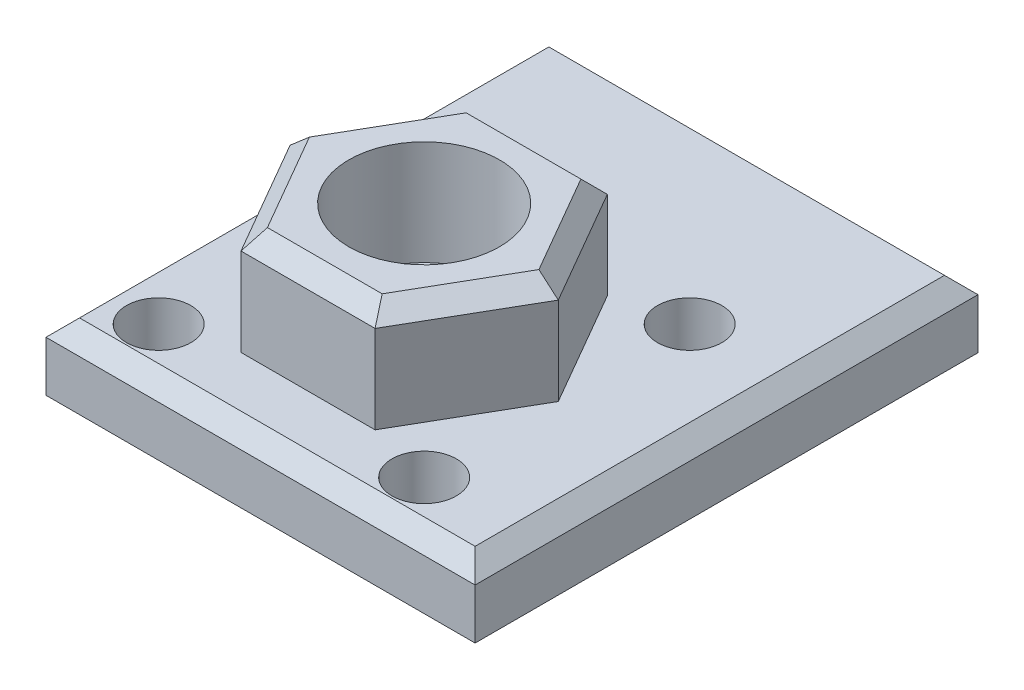
ISO-10303-21;
HEADER;
FILE_DESCRIPTION(('STEP AP214'),'2;1');
FILE_NAME('part.step','',(''),(''),'','','');
FILE_SCHEMA(('AUTOMOTIVE_DESIGN { 1 0 10303 214 1 1 1 1 }'));
ENDSEC;
DATA;
#1=APPLICATION_CONTEXT('core data for automotive mechanical design processes');
#2=APPLICATION_PROTOCOL_DEFINITION('international standard','automotive_design',2000,#1);
#3=PRODUCT_CONTEXT('',#1,'mechanical');
#4=PRODUCT('Part','Part','',(#3));
#5=PRODUCT_RELATED_PRODUCT_CATEGORY('part','',(#4));
#6=PRODUCT_DEFINITION_FORMATION('','',#4);
#7=PRODUCT_DEFINITION_CONTEXT('part definition',#1,'design');
#8=PRODUCT_DEFINITION('design','',#6,#7);
#9=PRODUCT_DEFINITION_SHAPE('','',#8);
#10=(LENGTH_UNIT() NAMED_UNIT(*) SI_UNIT(.MILLI.,.METRE.));
#11=(NAMED_UNIT(*) PLANE_ANGLE_UNIT() SI_UNIT($,.RADIAN.));
#12=(NAMED_UNIT(*) SI_UNIT($,.STERADIAN.) SOLID_ANGLE_UNIT());
#13=UNCERTAINTY_MEASURE_WITH_UNIT(LENGTH_MEASURE(1.E-05),#10,'distance_accuracy_value','');
#14=(GEOMETRIC_REPRESENTATION_CONTEXT(3) GLOBAL_UNCERTAINTY_ASSIGNED_CONTEXT((#13)) GLOBAL_UNIT_ASSIGNED_CONTEXT((#10,
#11,#12)) REPRESENTATION_CONTEXT('',''));
#15=CARTESIAN_POINT('',(0.,0.,0.));
#16=DIRECTION('',(0.,0.,1.));
#17=DIRECTION('',(1.,0.,0.));
#18=AXIS2_PLACEMENT_3D('',#15,#16,#17);
#19=CARTESIAN_POINT('',(18.415,0.,-30.734));
#20=DIRECTION('',(0.,1.,0.));
#21=DIRECTION('',(0.,0.,1.));
#22=AXIS2_PLACEMENT_3D('',#19,#20,#21);
#23=CYLINDRICAL_SURFACE('',#22,4.826);
#24=CARTESIAN_POINT('',(18.415,0.,-30.734));
#25=DIRECTION('',(0.,1.,0.));
#26=DIRECTION('',(0.,0.,1.));
#27=AXIS2_PLACEMENT_3D('',#24,#25,#26);
#28=CIRCLE('',#27,4.826);
#29=CARTESIAN_POINT('',(18.415,0.,-25.908));
#30=VERTEX_POINT('',#29);
#31=EDGE_CURVE('E164',#30,#30,#28,.T.);
#32=ORIENTED_EDGE('',*,*,#31,.F.);
#33=EDGE_LOOP('',(#32));
#34=FACE_BOUND('',#33,.T.);
#35=CARTESIAN_POINT('',(18.415,6.35,-30.734));
#36=DIRECTION('',(0.,1.,0.));
#37=DIRECTION('',(0.,0.,1.));
#38=AXIS2_PLACEMENT_3D('',#35,#36,#37);
#39=CIRCLE('',#38,4.826);
#40=CARTESIAN_POINT('',(18.415,6.35,-25.908));
#41=VERTEX_POINT('',#40);
#42=EDGE_CURVE('E234',#41,#41,#39,.F.);
#43=ORIENTED_EDGE('',*,*,#42,.F.);
#44=EDGE_LOOP('',(#43));
#45=FACE_BOUND('',#44,.T.);
#46=ADVANCED_FACE('F36',(#34,#45),#23,.F.);
#47=CARTESIAN_POINT('',(0.,6.35,0.));
#48=DIRECTION('',(0.,1.,0.));
#49=DIRECTION('',(0.,0.,1.));
#50=AXIS2_PLACEMENT_3D('',#47,#48,#49);
#51=PLANE('',#50);
#52=DIRECTION('',(-1.,0.,0.));
#53=VECTOR('',#52,1.);
#54=CARTESIAN_POINT('',(0.,6.35,-59.3725));
#55=LINE('',#54,#53);
#56=CARTESIAN_POINT('',(39.0525,6.35,-59.3725));
#57=VERTEX_POINT('',#56);
#58=CARTESIAN_POINT('',(1.58749999999999,6.35,-59.3725));
#59=VERTEX_POINT('',#58);
#60=EDGE_CURVE('E241',#57,#59,#55,.T.);
#61=ORIENTED_EDGE('',*,*,#60,.T.);
#62=DIRECTION('',(0.,0.,1.));
#63=VECTOR('',#62,1.);
#64=CARTESIAN_POINT('',(1.58749999999999,6.35,-13.335));
#65=LINE('',#64,#63);
#66=CARTESIAN_POINT('',(1.58749999999999,6.35,-14.9225));
#67=VERTEX_POINT('',#66);
#68=EDGE_CURVE('E243',#59,#67,#65,.T.);
#69=ORIENTED_EDGE('',*,*,#68,.T.);
#70=DIRECTION('',(1.,0.,0.));
#71=VECTOR('',#70,1.);
#72=CARTESIAN_POINT('',(40.64,6.35,-14.9225));
#73=LINE('',#72,#71);
#74=CARTESIAN_POINT('',(39.0525,6.35,-14.9225));
#75=VERTEX_POINT('',#74);
#76=EDGE_CURVE('E233',#67,#75,#73,.T.);
#77=ORIENTED_EDGE('',*,*,#76,.T.);
#78=DIRECTION('',(0.,0.,-1.));
#79=VECTOR('',#78,1.);
#80=CARTESIAN_POINT('',(39.0525,6.35,-60.96));
#81=LINE('',#80,#79);
#82=EDGE_CURVE('E239',#75,#57,#81,.T.);
#83=ORIENTED_EDGE('',*,*,#82,.T.);
#84=EDGE_LOOP('',(#61,#69,#77,#83));
#85=FACE_BOUND('',#84,.T.);
#86=CARTESIAN_POINT('',(5.84264143050334,6.35,-18.161641430503));
#87=DIRECTION('',(0.,1.,0.));
#88=DIRECTION('',(0.,0.,1.));
#89=AXIS2_PLACEMENT_3D('',#86,#87,#88);
#90=CIRCLE('',#89,3.048);
#91=CARTESIAN_POINT('',(5.84264143050334,6.35,-15.113641430503));
#92=VERTEX_POINT('',#91);
#93=EDGE_CURVE('E196',#92,#92,#90,.T.);
#94=ORIENTED_EDGE('',*,*,#93,.F.);
#95=EDGE_LOOP('',(#94));
#96=FACE_BOUND('',#95,.T.);
#97=CARTESIAN_POINT('',(30.9873585694968,6.35,-18.1616414305032));
#98=DIRECTION('',(0.,1.,0.));
#99=DIRECTION('',(0.,0.,1.));
#100=AXIS2_PLACEMENT_3D('',#97,#98,#99);
#101=CIRCLE('',#100,3.048);
#102=CARTESIAN_POINT('',(30.9873585694968,6.35,-15.1136414305032));
#103=VERTEX_POINT('',#102);
#104=EDGE_CURVE('E208',#103,#103,#101,.T.);
#105=ORIENTED_EDGE('',*,*,#104,.F.);
#106=EDGE_LOOP('',(#105));
#107=FACE_BOUND('',#106,.T.);
#108=CARTESIAN_POINT('',(30.9873585694967,6.35,-43.3063585694969));
#109=DIRECTION('',(0.,1.,0.));
#110=DIRECTION('',(0.,0.,1.));
#111=AXIS2_PLACEMENT_3D('',#108,#109,#110);
#112=CIRCLE('',#111,3.048);
#113=CARTESIAN_POINT('',(30.9873585694967,6.35,-40.2583585694969));
#114=VERTEX_POINT('',#113);
#115=EDGE_CURVE('E202',#114,#114,#112,.T.);
#116=ORIENTED_EDGE('',*,*,#115,.F.);
#117=EDGE_LOOP('',(#116));
#118=FACE_BOUND('',#117,.T.);
#119=CARTESIAN_POINT('',(5.84264143050316,6.35,-43.3063585694968));
#120=DIRECTION('',(0.,1.,0.));
#121=DIRECTION('',(0.,0.,1.));
#122=AXIS2_PLACEMENT_3D('',#119,#120,#121);
#123=CIRCLE('',#122,3.048);
#124=CARTESIAN_POINT('',(5.84264143050316,6.35,-40.2583585694968));
#125=VERTEX_POINT('',#124);
#126=EDGE_CURVE('E190',#125,#125,#123,.T.);
#127=ORIENTED_EDGE('',*,*,#126,.F.);
#128=EDGE_LOOP('',(#127));
#129=FACE_BOUND('',#128,.T.);
#130=DIRECTION('',(-0.500000000000001,0.,-0.866025403784438));
#131=VECTOR('',#130,1.);
#132=CARTESIAN_POINT('',(31.115,6.35,-30.734));
#133=LINE('',#132,#131);
#134=CARTESIAN_POINT('',(31.115,6.35,-30.734));
#135=VERTEX_POINT('',#134);
#136=CARTESIAN_POINT('',(24.765,6.35,-41.7325226280624));
#137=VERTEX_POINT('',#136);
#138=EDGE_CURVE('E147',#135,#137,#133,.T.);
#139=ORIENTED_EDGE('',*,*,#138,.F.);
#140=DIRECTION('',(0.499999999999995,0.,-0.866025403784441));
#141=VECTOR('',#140,1.);
#142=CARTESIAN_POINT('',(24.7650000000001,6.35,-19.7354773719377));
#143=LINE('',#142,#141);
#144=CARTESIAN_POINT('',(24.7650000000001,6.35,-19.7354773719377));
#145=VERTEX_POINT('',#144);
#146=EDGE_CURVE('E157',#145,#135,#143,.T.);
#147=ORIENTED_EDGE('',*,*,#146,.F.);
#148=DIRECTION('',(1.,0.,0.));
#149=VECTOR('',#148,1.);
#150=CARTESIAN_POINT('',(12.0650000000001,6.35,-19.7354773719376));
#151=LINE('',#150,#149);
#152=CARTESIAN_POINT('',(12.0650000000001,6.35,-19.7354773719376));
#153=VERTEX_POINT('',#152);
#154=EDGE_CURVE('E180',#153,#145,#151,.T.);
#155=ORIENTED_EDGE('',*,*,#154,.F.);
#156=DIRECTION('',(0.500000000000007,0.,0.866025403784435));
#157=VECTOR('',#156,1.);
#158=CARTESIAN_POINT('',(5.715,6.35,-30.7339999999999));
#159=LINE('',#158,#157);
#160=CARTESIAN_POINT('',(5.715,6.35,-30.7339999999999));
#161=VERTEX_POINT('',#160);
#162=EDGE_CURVE('E177',#161,#153,#159,.T.);
#163=ORIENTED_EDGE('',*,*,#162,.F.);
#164=DIRECTION('',(-0.499999999999995,0.,0.866025403784442));
#165=VECTOR('',#164,1.);
#166=CARTESIAN_POINT('',(12.065,6.35,-41.7325226280623));
#167=LINE('',#166,#165);
#168=CARTESIAN_POINT('',(12.065,6.35,-41.7325226280623));
#169=VERTEX_POINT('',#168);
#170=EDGE_CURVE('E171',#169,#161,#167,.T.);
#171=ORIENTED_EDGE('',*,*,#170,.F.);
#172=DIRECTION('',(-1.,0.,0.));
#173=VECTOR('',#172,1.);
#174=CARTESIAN_POINT('',(24.765,6.35,-41.7325226280624));
#175=LINE('',#174,#173);
#176=EDGE_CURVE('E169',#137,#169,#175,.T.);
#177=ORIENTED_EDGE('',*,*,#176,.F.);
#178=EDGE_LOOP('',(#139,#147,#155,#163,#171,#177));
#179=FACE_BOUND('',#178,.T.);
#180=ADVANCED_FACE('F166',(#85,#96,#107,#118,#129,#179),#51,.T.);
#181=CARTESIAN_POINT('',(0.,0.,0.));
#182=DIRECTION('',(0.,1.,0.));
#183=DIRECTION('',(0.,0.,1.));
#184=AXIS2_PLACEMENT_3D('',#181,#182,#183);
#185=PLANE('',#184);
#186=ORIENTED_EDGE('',*,*,#31,.T.);
#187=EDGE_LOOP('',(#186));
#188=FACE_BOUND('',#187,.T.);
#189=DIRECTION('',(1.,0.,0.));
#190=VECTOR('',#189,1.);
#191=CARTESIAN_POINT('',(40.64,0.,-13.335));
#192=LINE('',#191,#190);
#193=CARTESIAN_POINT('',(0.,0.,-13.335));
#194=VERTEX_POINT('',#193);
#195=CARTESIAN_POINT('',(40.64,0.,-13.335));
#196=VERTEX_POINT('',#195);
#197=EDGE_CURVE('E211',#194,#196,#192,.T.);
#198=ORIENTED_EDGE('',*,*,#197,.F.);
#199=DIRECTION('',(0.,0.,1.));
#200=VECTOR('',#199,1.);
#201=CARTESIAN_POINT('',(0.,0.,-60.96));
#202=LINE('',#201,#200);
#203=CARTESIAN_POINT('',(0.,0.,-60.96));
#204=VERTEX_POINT('',#203);
#205=EDGE_CURVE('E222',#204,#194,#202,.T.);
#206=ORIENTED_EDGE('',*,*,#205,.F.);
#207=DIRECTION('',(-1.,0.,0.));
#208=VECTOR('',#207,1.);
#209=CARTESIAN_POINT('',(40.64,0.,-60.96));
#210=LINE('',#209,#208);
#211=CARTESIAN_POINT('',(40.64,0.,-60.96));
#212=VERTEX_POINT('',#211);
#213=EDGE_CURVE('E219',#212,#204,#210,.T.);
#214=ORIENTED_EDGE('',*,*,#213,.F.);
#215=DIRECTION('',(0.,0.,-1.));
#216=VECTOR('',#215,1.);
#217=CARTESIAN_POINT('',(40.64,0.,-13.335));
#218=LINE('',#217,#216);
#219=EDGE_CURVE('E216',#196,#212,#218,.T.);
#220=ORIENTED_EDGE('',*,*,#219,.F.);
#221=EDGE_LOOP('',(#198,#206,#214,#220));
#222=FACE_BOUND('',#221,.T.);
#223=CARTESIAN_POINT('',(30.9873585694968,0.,-18.1616414305032));
#224=DIRECTION('',(0.,1.,0.));
#225=DIRECTION('',(0.,0.,1.));
#226=AXIS2_PLACEMENT_3D('',#223,#224,#225);
#227=CIRCLE('',#226,3.048);
#228=CARTESIAN_POINT('',(30.9873585694968,0.,-15.1136414305032));
#229=VERTEX_POINT('',#228);
#230=EDGE_CURVE('E205',#229,#229,#227,.T.);
#231=ORIENTED_EDGE('',*,*,#230,.T.);
#232=EDGE_LOOP('',(#231));
#233=FACE_BOUND('',#232,.T.);
#234=CARTESIAN_POINT('',(30.9873585694967,0.,-43.3063585694969));
#235=DIRECTION('',(0.,1.,0.));
#236=DIRECTION('',(0.,0.,1.));
#237=AXIS2_PLACEMENT_3D('',#234,#235,#236);
#238=CIRCLE('',#237,3.048);
#239=CARTESIAN_POINT('',(30.9873585694967,0.,-40.2583585694969));
#240=VERTEX_POINT('',#239);
#241=EDGE_CURVE('E199',#240,#240,#238,.T.);
#242=ORIENTED_EDGE('',*,*,#241,.T.);
#243=EDGE_LOOP('',(#242));
#244=FACE_BOUND('',#243,.T.);
#245=CARTESIAN_POINT('',(5.84264143050334,0.,-18.161641430503));
#246=DIRECTION('',(0.,1.,0.));
#247=DIRECTION('',(0.,0.,1.));
#248=AXIS2_PLACEMENT_3D('',#245,#246,#247);
#249=CIRCLE('',#248,3.048);
#250=CARTESIAN_POINT('',(5.84264143050334,0.,-15.113641430503));
#251=VERTEX_POINT('',#250);
#252=EDGE_CURVE('E193',#251,#251,#249,.T.);
#253=ORIENTED_EDGE('',*,*,#252,.T.);
#254=EDGE_LOOP('',(#253));
#255=FACE_BOUND('',#254,.T.);
#256=CARTESIAN_POINT('',(5.84264143050316,0.,-43.3063585694968));
#257=DIRECTION('',(0.,1.,0.));
#258=DIRECTION('',(0.,0.,1.));
#259=AXIS2_PLACEMENT_3D('',#256,#257,#258);
#260=CIRCLE('',#259,3.048);
#261=CARTESIAN_POINT('',(5.84264143050316,0.,-40.2583585694968));
#262=VERTEX_POINT('',#261);
#263=EDGE_CURVE('E153',#262,#262,#260,.T.);
#264=ORIENTED_EDGE('',*,*,#263,.T.);
#265=EDGE_LOOP('',(#264));
#266=FACE_BOUND('',#265,.T.);
#267=ADVANCED_FACE('F336',(#188,#222,#233,#244,#255,#266),#185,.F.);
#268=CARTESIAN_POINT('',(40.64,6.35,-13.335));
#269=DIRECTION('',(0.,0.,-1.));
#270=DIRECTION('',(-1.,0.,0.));
#271=AXIS2_PLACEMENT_3D('',#268,#269,#270);
#272=PLANE('',#271);
#273=DIRECTION('',(0.,-1.,0.));
#274=VECTOR('',#273,1.);
#275=CARTESIAN_POINT('',(40.64,6.35,-13.335));
#276=LINE('',#275,#274);
#277=CARTESIAN_POINT('',(40.64,4.7625,-13.335));
#278=VERTEX_POINT('',#277);
#279=EDGE_CURVE('E231',#278,#196,#276,.T.);
#280=ORIENTED_EDGE('',*,*,#279,.F.);
#281=DIRECTION('',(-1.,0.,0.));
#282=VECTOR('',#281,1.);
#283=CARTESIAN_POINT('',(0.,4.7625,-13.335));
#284=LINE('',#283,#282);
#285=CARTESIAN_POINT('',(0.,4.7625,-13.335));
#286=VERTEX_POINT('',#285);
#287=EDGE_CURVE('E253',#278,#286,#284,.T.);
#288=ORIENTED_EDGE('',*,*,#287,.T.);
#289=DIRECTION('',(0.,-1.,0.));
#290=VECTOR('',#289,1.);
#291=CARTESIAN_POINT('',(0.,6.35,-13.335));
#292=LINE('',#291,#290);
#293=EDGE_CURVE('E225',#286,#194,#292,.T.);
#294=ORIENTED_EDGE('',*,*,#293,.T.);
#295=ORIENTED_EDGE('',*,*,#197,.T.);
#296=EDGE_LOOP('',(#280,#288,#294,#295));
#297=FACE_BOUND('',#296,.T.);
#298=ADVANCED_FACE('F573',(#297),#272,.F.);
#299=CARTESIAN_POINT('',(40.64,6.35,-13.335));
#300=DIRECTION('',(-1.,0.,0.));
#301=DIRECTION('',(0.,0.,1.));
#302=AXIS2_PLACEMENT_3D('',#299,#300,#301);
#303=PLANE('',#302);
#304=DIRECTION('',(0.,-1.,0.));
#305=VECTOR('',#304,1.);
#306=CARTESIAN_POINT('',(40.64,6.35,-60.96));
#307=LINE('',#306,#305);
#308=CARTESIAN_POINT('',(40.64,4.7625,-60.96));
#309=VERTEX_POINT('',#308);
#310=EDGE_CURVE('E229',#309,#212,#307,.T.);
#311=ORIENTED_EDGE('',*,*,#310,.F.);
#312=DIRECTION('',(0.,0.,1.));
#313=VECTOR('',#312,1.);
#314=CARTESIAN_POINT('',(40.64,4.7625,-13.335));
#315=LINE('',#314,#313);
#316=EDGE_CURVE('E251',#309,#278,#315,.T.);
#317=ORIENTED_EDGE('',*,*,#316,.T.);
#318=ORIENTED_EDGE('',*,*,#279,.T.);
#319=ORIENTED_EDGE('',*,*,#219,.T.);
#320=EDGE_LOOP('',(#311,#317,#318,#319));
#321=FACE_BOUND('',#320,.T.);
#322=ADVANCED_FACE('F564',(#321),#303,.F.);
#323=CARTESIAN_POINT('',(40.64,6.35,-60.96));
#324=DIRECTION('',(0.,0.,1.));
#325=DIRECTION('',(1.,0.,0.));
#326=AXIS2_PLACEMENT_3D('',#323,#324,#325);
#327=PLANE('',#326);
#328=DIRECTION('',(0.,-1.,0.));
#329=VECTOR('',#328,1.);
#330=CARTESIAN_POINT('',(0.,6.35,-60.96));
#331=LINE('',#330,#329);
#332=CARTESIAN_POINT('',(0.,4.7625,-60.96));
#333=VERTEX_POINT('',#332);
#334=EDGE_CURVE('E227',#333,#204,#331,.T.);
#335=ORIENTED_EDGE('',*,*,#334,.F.);
#336=DIRECTION('',(1.,0.,0.));
#337=VECTOR('',#336,1.);
#338=CARTESIAN_POINT('',(40.64,4.7625,-60.96));
#339=LINE('',#338,#337);
#340=EDGE_CURVE('E249',#333,#309,#339,.T.);
#341=ORIENTED_EDGE('',*,*,#340,.T.);
#342=ORIENTED_EDGE('',*,*,#310,.T.);
#343=ORIENTED_EDGE('',*,*,#213,.T.);
#344=EDGE_LOOP('',(#335,#341,#342,#343));
#345=FACE_BOUND('',#344,.T.);
#346=ADVANCED_FACE('F555',(#345),#327,.F.);
#347=CARTESIAN_POINT('',(0.,6.35,-60.96));
#348=DIRECTION('',(1.,0.,0.));
#349=DIRECTION('',(0.,0.,-1.));
#350=AXIS2_PLACEMENT_3D('',#347,#348,#349);
#351=PLANE('',#350);
#352=ORIENTED_EDGE('',*,*,#293,.F.);
#353=DIRECTION('',(0.,0.,-1.));
#354=VECTOR('',#353,1.);
#355=CARTESIAN_POINT('',(0.,4.7625,-60.96));
#356=LINE('',#355,#354);
#357=EDGE_CURVE('E246',#286,#333,#356,.T.);
#358=ORIENTED_EDGE('',*,*,#357,.T.);
#359=ORIENTED_EDGE('',*,*,#334,.T.);
#360=ORIENTED_EDGE('',*,*,#205,.T.);
#361=EDGE_LOOP('',(#352,#358,#359,#360));
#362=FACE_BOUND('',#361,.T.);
#363=ADVANCED_FACE('F547',(#362),#351,.F.);
#364=CARTESIAN_POINT('',(30.9873585694968,6.35,-18.1616414305032));
#365=DIRECTION('',(0.,-1.,0.));
#366=DIRECTION('',(0.,0.,-1.));
#367=AXIS2_PLACEMENT_3D('',#364,#365,#366);
#368=CYLINDRICAL_SURFACE('',#367,3.048);
#369=ORIENTED_EDGE('',*,*,#104,.T.);
#370=EDGE_LOOP('',(#369));
#371=FACE_BOUND('',#370,.T.);
#372=ORIENTED_EDGE('',*,*,#230,.F.);
#373=EDGE_LOOP('',(#372));
#374=FACE_BOUND('',#373,.T.);
#375=ADVANCED_FACE('F538',(#371,#374),#368,.F.);
#376=CARTESIAN_POINT('',(30.9873585694967,6.35,-43.3063585694969));
#377=DIRECTION('',(0.,-1.,0.));
#378=DIRECTION('',(0.,0.,-1.));
#379=AXIS2_PLACEMENT_3D('',#376,#377,#378);
#380=CYLINDRICAL_SURFACE('',#379,3.048);
#381=ORIENTED_EDGE('',*,*,#115,.T.);
#382=EDGE_LOOP('',(#381));
#383=FACE_BOUND('',#382,.T.);
#384=ORIENTED_EDGE('',*,*,#241,.F.);
#385=EDGE_LOOP('',(#384));
#386=FACE_BOUND('',#385,.T.);
#387=ADVANCED_FACE('F529',(#383,#386),#380,.F.);
#388=CARTESIAN_POINT('',(5.84264143050334,6.35,-18.161641430503));
#389=DIRECTION('',(0.,-1.,0.));
#390=DIRECTION('',(0.,0.,-1.));
#391=AXIS2_PLACEMENT_3D('',#388,#389,#390);
#392=CYLINDRICAL_SURFACE('',#391,3.048);
#393=ORIENTED_EDGE('',*,*,#93,.T.);
#394=EDGE_LOOP('',(#393));
#395=FACE_BOUND('',#394,.T.);
#396=ORIENTED_EDGE('',*,*,#252,.F.);
#397=EDGE_LOOP('',(#396));
#398=FACE_BOUND('',#397,.T.);
#399=ADVANCED_FACE('F520',(#395,#398),#392,.F.);
#400=CARTESIAN_POINT('',(5.84264143050316,6.35,-43.3063585694968));
#401=DIRECTION('',(0.,-1.,0.));
#402=DIRECTION('',(0.,0.,-1.));
#403=AXIS2_PLACEMENT_3D('',#400,#401,#402);
#404=CYLINDRICAL_SURFACE('',#403,3.048);
#405=ORIENTED_EDGE('',*,*,#126,.T.);
#406=EDGE_LOOP('',(#405));
#407=FACE_BOUND('',#406,.T.);
#408=ORIENTED_EDGE('',*,*,#263,.F.);
#409=EDGE_LOOP('',(#408));
#410=FACE_BOUND('',#409,.T.);
#411=ADVANCED_FACE('F506',(#407,#410),#404,.F.);
#412=CARTESIAN_POINT('',(24.7650000000001,16.256,-19.7354773719377));
#413=DIRECTION('',(-0.866025403784441,0.,-0.499999999999995));
#414=DIRECTION('',(-0.499999999999995,0.,0.866025403784441));
#415=AXIS2_PLACEMENT_3D('',#412,#413,#414);
#416=PLANE('',#415);
#417=DIRECTION('',(0.,-1.,0.));
#418=VECTOR('',#417,1.);
#419=CARTESIAN_POINT('',(31.115,16.256,-30.734));
#420=LINE('',#419,#418);
#421=CARTESIAN_POINT('',(31.115,14.6685,-30.734));
#422=VERTEX_POINT('',#421);
#423=EDGE_CURVE('E143',#422,#135,#420,.T.);
#424=ORIENTED_EDGE('',*,*,#423,.F.);
#425=DIRECTION('',(-0.499999999999995,0.,0.866025403784441));
#426=VECTOR('',#425,1.);
#427=CARTESIAN_POINT('',(24.7650000000001,14.6685,-19.7354773719377));
#428=LINE('',#427,#426);
#429=CARTESIAN_POINT('',(24.7650000000001,14.6685,-19.7354773719377));
#430=VERTEX_POINT('',#429);
#431=EDGE_CURVE('E273',#422,#430,#428,.T.);
#432=ORIENTED_EDGE('',*,*,#431,.T.);
#433=DIRECTION('',(0.,-1.,0.));
#434=VECTOR('',#433,1.);
#435=CARTESIAN_POINT('',(24.7650000000001,16.256,-19.7354773719377));
#436=LINE('',#435,#434);
#437=EDGE_CURVE('E160',#430,#145,#436,.T.);
#438=ORIENTED_EDGE('',*,*,#437,.T.);
#439=ORIENTED_EDGE('',*,*,#146,.T.);
#440=EDGE_LOOP('',(#424,#432,#438,#439));
#441=FACE_BOUND('',#440,.T.);
#442=ADVANCED_FACE('F158',(#441),#416,.F.);
#443=CARTESIAN_POINT('',(31.115,16.256,-30.734));
#444=DIRECTION('',(-0.866025403784438,0.,0.500000000000001));
#445=DIRECTION('',(0.500000000000001,0.,0.866025403784438));
#446=AXIS2_PLACEMENT_3D('',#443,#444,#445);
#447=PLANE('',#446);
#448=DIRECTION('',(0.,-1.,0.));
#449=VECTOR('',#448,1.);
#450=CARTESIAN_POINT('',(24.765,16.256,-41.7325226280624));
#451=LINE('',#450,#449);
#452=CARTESIAN_POINT('',(24.765,14.6685,-41.7325226280624));
#453=VERTEX_POINT('',#452);
#454=EDGE_CURVE('E154',#453,#137,#451,.T.);
#455=ORIENTED_EDGE('',*,*,#454,.F.);
#456=DIRECTION('',(0.500000000000001,0.,0.866025403784438));
#457=VECTOR('',#456,1.);
#458=CARTESIAN_POINT('',(31.115,14.6685,-30.734));
#459=LINE('',#458,#457);
#460=EDGE_CURVE('E150',#453,#422,#459,.T.);
#461=ORIENTED_EDGE('',*,*,#460,.T.);
#462=ORIENTED_EDGE('',*,*,#423,.T.);
#463=ORIENTED_EDGE('',*,*,#138,.T.);
#464=EDGE_LOOP('',(#455,#461,#462,#463));
#465=FACE_BOUND('',#464,.T.);
#466=ADVANCED_FACE('F145',(#465),#447,.F.);
#467=CARTESIAN_POINT('',(24.765,16.256,-41.7325226280624));
#468=DIRECTION('',(0.,0.,1.));
#469=DIRECTION('',(1.,0.,0.));
#470=AXIS2_PLACEMENT_3D('',#467,#468,#469);
#471=PLANE('',#470);
#472=DIRECTION('',(0.,-1.,0.));
#473=VECTOR('',#472,1.);
#474=CARTESIAN_POINT('',(12.065,16.256,-41.7325226280623));
#475=LINE('',#474,#473);
#476=CARTESIAN_POINT('',(12.065,14.6685,-41.7325226280623));
#477=VERTEX_POINT('',#476);
#478=EDGE_CURVE('E187',#477,#169,#475,.T.);
#479=ORIENTED_EDGE('',*,*,#478,.F.);
#480=DIRECTION('',(1.,0.,0.));
#481=VECTOR('',#480,1.);
#482=CARTESIAN_POINT('',(24.765,14.6685,-41.7325226280624));
#483=LINE('',#482,#481);
#484=EDGE_CURVE('E45',#477,#453,#483,.T.);
#485=ORIENTED_EDGE('',*,*,#484,.T.);
#486=ORIENTED_EDGE('',*,*,#454,.T.);
#487=ORIENTED_EDGE('',*,*,#176,.T.);
#488=EDGE_LOOP('',(#479,#485,#486,#487));
#489=FACE_BOUND('',#488,.T.);
#490=ADVANCED_FACE('F321',(#489),#471,.F.);
#491=CARTESIAN_POINT('',(12.065,16.256,-41.7325226280623));
#492=DIRECTION('',(0.866025403784442,0.,0.499999999999995));
#493=DIRECTION('',(0.499999999999995,0.,-0.866025403784442));
#494=AXIS2_PLACEMENT_3D('',#491,#492,#493);
#495=PLANE('',#494);
#496=DIRECTION('',(0.,-1.,0.));
#497=VECTOR('',#496,1.);
#498=CARTESIAN_POINT('',(5.715,16.256,-30.7339999999999));
#499=LINE('',#498,#497);
#500=CARTESIAN_POINT('',(5.715,14.6685,-30.7339999999999));
#501=VERTEX_POINT('',#500);
#502=EDGE_CURVE('E185',#501,#161,#499,.T.);
#503=ORIENTED_EDGE('',*,*,#502,.F.);
#504=DIRECTION('',(0.499999999999995,0.,-0.866025403784442));
#505=VECTOR('',#504,1.);
#506=CARTESIAN_POINT('',(12.065,14.6685,-41.7325226280623));
#507=LINE('',#506,#505);
#508=EDGE_CURVE('E11',#501,#477,#507,.T.);
#509=ORIENTED_EDGE('',*,*,#508,.T.);
#510=ORIENTED_EDGE('',*,*,#478,.T.);
#511=ORIENTED_EDGE('',*,*,#170,.T.);
#512=EDGE_LOOP('',(#503,#509,#510,#511));
#513=FACE_BOUND('',#512,.T.);
#514=ADVANCED_FACE('F320',(#513),#495,.F.);
#515=CARTESIAN_POINT('',(5.715,16.256,-30.7339999999999));
#516=DIRECTION('',(0.866025403784435,0.,-0.500000000000007));
#517=DIRECTION('',(-0.500000000000007,0.,-0.866025403784435));
#518=AXIS2_PLACEMENT_3D('',#515,#516,#517);
#519=PLANE('',#518);
#520=DIRECTION('',(0.,-1.,0.));
#521=VECTOR('',#520,1.);
#522=CARTESIAN_POINT('',(12.0650000000001,16.256,-19.7354773719376));
#523=LINE('',#522,#521);
#524=CARTESIAN_POINT('',(12.0650000000001,14.6685,-19.7354773719376));
#525=VERTEX_POINT('',#524);
#526=EDGE_CURVE('E183',#525,#153,#523,.T.);
#527=ORIENTED_EDGE('',*,*,#526,.F.);
#528=DIRECTION('',(-0.500000000000007,0.,-0.866025403784435));
#529=VECTOR('',#528,1.);
#530=CARTESIAN_POINT('',(5.715,14.6685,-30.7339999999999));
#531=LINE('',#530,#529);
#532=EDGE_CURVE('E268',#525,#501,#531,.T.);
#533=ORIENTED_EDGE('',*,*,#532,.T.);
#534=ORIENTED_EDGE('',*,*,#502,.T.);
#535=ORIENTED_EDGE('',*,*,#162,.T.);
#536=EDGE_LOOP('',(#527,#533,#534,#535));
#537=FACE_BOUND('',#536,.T.);
#538=ADVANCED_FACE('F318',(#537),#519,.F.);
#539=CARTESIAN_POINT('',(12.0650000000001,16.256,-19.7354773719376));
#540=DIRECTION('',(0.,0.,-1.));
#541=DIRECTION('',(-1.,0.,0.));
#542=AXIS2_PLACEMENT_3D('',#539,#540,#541);
#543=PLANE('',#542);
#544=ORIENTED_EDGE('',*,*,#437,.F.);
#545=DIRECTION('',(-1.,0.,0.));
#546=VECTOR('',#545,1.);
#547=CARTESIAN_POINT('',(12.0650000000001,14.6685,-19.7354773719376));
#548=LINE('',#547,#546);
#549=EDGE_CURVE('E271',#430,#525,#548,.T.);
#550=ORIENTED_EDGE('',*,*,#549,.T.);
#551=ORIENTED_EDGE('',*,*,#526,.T.);
#552=ORIENTED_EDGE('',*,*,#154,.T.);
#553=EDGE_LOOP('',(#544,#550,#551,#552));
#554=FACE_BOUND('',#553,.T.);
#555=ADVANCED_FACE('F314',(#554),#543,.F.);
#556=CARTESIAN_POINT('',(0.,16.256,0.));
#557=DIRECTION('',(0.,1.,0.));
#558=DIRECTION('',(0.,0.,1.));
#559=AXIS2_PLACEMENT_3D('',#556,#557,#558);
#560=PLANE('',#559);
#561=DIRECTION('',(-0.499999999999995,0.,0.866025403784442));
#562=VECTOR('',#561,1.);
#563=CARTESIAN_POINT('',(7.0898153285078,16.256,-29.9402499999999));
#564=LINE('',#563,#562);
#565=CARTESIAN_POINT('',(12.9815435523385,16.256,-40.1450226280623));
#566=VERTEX_POINT('',#565);
#567=CARTESIAN_POINT('',(7.54808710467707,16.256,-30.7339999999999));
#568=VERTEX_POINT('',#567);
#569=EDGE_CURVE('E255',#566,#568,#564,.T.);
#570=ORIENTED_EDGE('',*,*,#569,.T.);
#571=DIRECTION('',(0.500000000000007,0.,0.866025403784435));
#572=VECTOR('',#571,1.);
#573=CARTESIAN_POINT('',(13.4398153285079,16.256,-20.5292273719376));
#574=LINE('',#573,#572);
#575=CARTESIAN_POINT('',(12.9815435523386,16.256,-21.3229773719376));
#576=VERTEX_POINT('',#575);
#577=EDGE_CURVE('E265',#568,#576,#574,.T.);
#578=ORIENTED_EDGE('',*,*,#577,.T.);
#579=DIRECTION('',(1.,0.,0.));
#580=VECTOR('',#579,1.);
#581=CARTESIAN_POINT('',(24.7650000000001,16.256,-21.3229773719377));
#582=LINE('',#581,#580);
#583=CARTESIAN_POINT('',(23.8484564476616,16.256,-21.3229773719377));
#584=VERTEX_POINT('',#583);
#585=EDGE_CURVE('E263',#576,#584,#582,.T.);
#586=ORIENTED_EDGE('',*,*,#585,.T.);
#587=DIRECTION('',(0.499999999999995,0.,-0.866025403784441));
#588=VECTOR('',#587,1.);
#589=CARTESIAN_POINT('',(29.7401846714922,16.256,-31.52775));
#590=LINE('',#589,#588);
#591=CARTESIAN_POINT('',(29.2819128953229,16.256,-30.734));
#592=VERTEX_POINT('',#591);
#593=EDGE_CURVE('E261',#584,#592,#590,.T.);
#594=ORIENTED_EDGE('',*,*,#593,.T.);
#595=DIRECTION('',(-0.500000000000001,0.,-0.866025403784438));
#596=VECTOR('',#595,1.);
#597=CARTESIAN_POINT('',(23.3901846714922,16.256,-40.9387726280624));
#598=LINE('',#597,#596);
#599=CARTESIAN_POINT('',(23.8484564476614,16.256,-40.1450226280624));
#600=VERTEX_POINT('',#599);
#601=EDGE_CURVE('E259',#592,#600,#598,.T.);
#602=ORIENTED_EDGE('',*,*,#601,.T.);
#603=DIRECTION('',(-1.,0.,0.));
#604=VECTOR('',#603,1.);
#605=CARTESIAN_POINT('',(12.065,16.256,-40.1450226280623));
#606=LINE('',#605,#604);
#607=EDGE_CURVE('E257',#600,#566,#606,.T.);
#608=ORIENTED_EDGE('',*,*,#607,.T.);
#609=EDGE_LOOP('',(#570,#578,#586,#594,#602,#608));
#610=FACE_BOUND('',#609,.T.);
#611=CARTESIAN_POINT('',(18.415,16.256,-30.734));
#612=DIRECTION('',(0.,1.,0.));
#613=DIRECTION('',(0.,0.,1.));
#614=AXIS2_PLACEMENT_3D('',#611,#612,#613);
#615=CIRCLE('',#614,7.1374);
#616=CARTESIAN_POINT('',(18.415,16.256,-23.5966));
#617=VERTEX_POINT('',#616);
#618=EDGE_CURVE('E287',#617,#617,#615,.T.);
#619=ORIENTED_EDGE('',*,*,#618,.F.);
#620=EDGE_LOOP('',(#619));
#621=FACE_BOUND('',#620,.T.);
#622=ADVANCED_FACE('F345',(#610,#621),#560,.T.);
#623=CARTESIAN_POINT('',(18.415,6.35,-30.734));
#624=DIRECTION('',(0.,1.,0.));
#625=DIRECTION('',(0.,0.,1.));
#626=AXIS2_PLACEMENT_3D('',#623,#624,#625);
#627=PLANE('',#626);
#628=CARTESIAN_POINT('',(18.415,6.35,-30.734));
#629=DIRECTION('',(0.,1.,0.));
#630=DIRECTION('',(0.,0.,1.));
#631=AXIS2_PLACEMENT_3D('',#628,#629,#630);
#632=CIRCLE('',#631,7.1374);
#633=CARTESIAN_POINT('',(18.415,6.35,-23.5966));
#634=VERTEX_POINT('',#633);
#635=EDGE_CURVE('E237',#634,#634,#632,.T.);
#636=ORIENTED_EDGE('',*,*,#635,.T.);
#637=EDGE_LOOP('',(#636));
#638=FACE_BOUND('',#637,.T.);
#639=ORIENTED_EDGE('',*,*,#42,.T.);
#640=EDGE_LOOP('',(#639));
#641=FACE_BOUND('',#640,.T.);
#642=ADVANCED_FACE('F348',(#638,#641),#627,.T.);
#643=CARTESIAN_POINT('',(18.415,6.35,-30.734));
#644=DIRECTION('',(0.,1.,0.));
#645=DIRECTION('',(0.,0.,1.));
#646=AXIS2_PLACEMENT_3D('',#643,#644,#645);
#647=CYLINDRICAL_SURFACE('',#646,7.1374);
#648=ORIENTED_EDGE('',*,*,#635,.F.);
#649=EDGE_LOOP('',(#648));
#650=FACE_BOUND('',#649,.T.);
#651=ORIENTED_EDGE('',*,*,#618,.T.);
#652=EDGE_LOOP('',(#651));
#653=FACE_BOUND('',#652,.T.);
#654=ADVANCED_FACE('F343',(#650,#653),#647,.F.);
#655=CARTESIAN_POINT('',(39.0525,6.35,0.));
#656=DIRECTION('',(0.707106781186549,0.707106781186546,0.));
#657=DIRECTION('',(0.,0.,1.));
#658=AXIS2_PLACEMENT_3D('',#655,#656,#657);
#659=PLANE('',#658);
#660=DIRECTION('',(-0.577350269189626,0.577350269189627,-0.577350269189625));
#661=VECTOR('',#660,1.);
#662=CARTESIAN_POINT('',(26.035,19.3675,-27.94));
#663=LINE('',#662,#661);
#664=EDGE_CURVE('E281',#278,#75,#663,.T.);
#665=ORIENTED_EDGE('',*,*,#664,.F.);
#666=ORIENTED_EDGE('',*,*,#316,.F.);
#667=DIRECTION('',(-0.577350269189625,0.577350269189627,0.577350269189625));
#668=VECTOR('',#667,1.);
#669=CARTESIAN_POINT('',(19.2616666666667,26.1408333333333,-39.5816666666667));
#670=LINE('',#669,#668);
#671=EDGE_CURVE('E284',#57,#309,#670,.F.);
#672=ORIENTED_EDGE('',*,*,#671,.F.);
#673=ORIENTED_EDGE('',*,*,#82,.F.);
#674=EDGE_LOOP('',(#665,#666,#672,#673));
#675=FACE_BOUND('',#674,.T.);
#676=ADVANCED_FACE('F378',(#675),#659,.T.);
#677=CARTESIAN_POINT('',(0.,6.35,-59.3725));
#678=DIRECTION('',(0.,0.707106781186546,-0.707106781186549));
#679=DIRECTION('',(1.,0.,0.));
#680=AXIS2_PLACEMENT_3D('',#677,#678,#679);
#681=PLANE('',#680);
#682=ORIENTED_EDGE('',*,*,#671,.T.);
#683=ORIENTED_EDGE('',*,*,#340,.F.);
#684=DIRECTION('',(0.577350269189625,0.577350269189628,0.577350269189625));
#685=VECTOR('',#684,1.);
#686=CARTESIAN_POINT('',(1.05833333333332,5.82083333333333,-59.9016666666667));
#687=LINE('',#686,#685);
#688=EDGE_CURVE('E279',#59,#333,#687,.F.);
#689=ORIENTED_EDGE('',*,*,#688,.F.);
#690=ORIENTED_EDGE('',*,*,#60,.F.);
#691=EDGE_LOOP('',(#682,#683,#689,#690));
#692=FACE_BOUND('',#691,.T.);
#693=ADVANCED_FACE('F385',(#692),#681,.T.);
#694=CARTESIAN_POINT('',(0.,6.35,-14.9225));
#695=DIRECTION('',(0.,0.707106781186546,0.707106781186549));
#696=DIRECTION('',(-1.,0.,0.));
#697=AXIS2_PLACEMENT_3D('',#694,#695,#696);
#698=PLANE('',#697);
#699=ORIENTED_EDGE('',*,*,#664,.T.);
#700=ORIENTED_EDGE('',*,*,#76,.F.);
#701=DIRECTION('',(-0.577350269189625,-0.577350269189628,0.577350269189625));
#702=VECTOR('',#701,1.);
#703=CARTESIAN_POINT('',(1.05833333333333,5.82083333333333,-14.3933333333333));
#704=LINE('',#703,#702);
#705=EDGE_CURVE('E277',#286,#67,#704,.F.);
#706=ORIENTED_EDGE('',*,*,#705,.F.);
#707=ORIENTED_EDGE('',*,*,#287,.F.);
#708=EDGE_LOOP('',(#699,#700,#706,#707));
#709=FACE_BOUND('',#708,.T.);
#710=ADVANCED_FACE('F393',(#709),#698,.T.);
#711=CARTESIAN_POINT('',(1.5875,6.35,0.));
#712=DIRECTION('',(-0.707106781186549,0.707106781186546,0.));
#713=DIRECTION('',(0.,0.,-1.));
#714=AXIS2_PLACEMENT_3D('',#711,#712,#713);
#715=PLANE('',#714);
#716=ORIENTED_EDGE('',*,*,#688,.T.);
#717=ORIENTED_EDGE('',*,*,#357,.F.);
#718=ORIENTED_EDGE('',*,*,#705,.T.);
#719=ORIENTED_EDGE('',*,*,#68,.F.);
#720=EDGE_LOOP('',(#716,#717,#718,#719));
#721=FACE_BOUND('',#720,.T.);
#722=ADVANCED_FACE('F401',(#721),#715,.T.);
#723=CARTESIAN_POINT('',(35.2696470514477,16.256,-20.3629402193765));
#724=DIRECTION('',(0.612372435695794,0.707106781186547,-0.353553390593274));
#725=DIRECTION('',(0.500000000000001,0.,0.866025403784438));
#726=AXIS2_PLACEMENT_3D('',#723,#724,#725);
#727=PLANE('',#726);
#728=DIRECTION('',(0.755928946018454,-0.654653670707978,0.));
#729=VECTOR('',#728,1.);
#730=CARTESIAN_POINT('',(32.7034752702513,13.292840062679,-30.734));
#731=LINE('',#730,#729);
#732=EDGE_CURVE('E297',#422,#592,#731,.F.);
#733=ORIENTED_EDGE('',*,*,#732,.F.);
#734=ORIENTED_EDGE('',*,*,#460,.F.);
#735=DIRECTION('',(0.377964473009227,-0.654653670707977,-0.654653670707977));
#736=VECTOR('',#735,1.);
#737=CARTESIAN_POINT('',(20.4415340979955,22.1569626070634,-34.244060020999));
#738=LINE('',#737,#736);
#739=EDGE_CURVE('E40',#600,#453,#738,.T.);
#740=ORIENTED_EDGE('',*,*,#739,.F.);
#741=ORIENTED_EDGE('',*,*,#601,.F.);
#742=EDGE_LOOP('',(#733,#734,#740,#741));
#743=FACE_BOUND('',#742,.T.);
#744=ADVANCED_FACE('F38',(#743),#727,.T.);
#745=CARTESIAN_POINT('',(-1.31604119426494E-13,16.256,-40.1450226280623));
#746=DIRECTION('',(0.,0.707106781186547,-0.707106781186549));
#747=DIRECTION('',(1.,0.,0.));
#748=AXIS2_PLACEMENT_3D('',#745,#746,#747);
#749=PLANE('',#748);
#750=ORIENTED_EDGE('',*,*,#739,.T.);
#751=ORIENTED_EDGE('',*,*,#484,.F.);
#752=DIRECTION('',(-0.37796447300923,-0.654653670707978,-0.654653670707975));
#753=VECTOR('',#752,1.);
#754=CARTESIAN_POINT('',(18.8754551534203,26.4645543483933,-29.9364682796691));
#755=LINE('',#754,#753);
#756=EDGE_CURVE('E295',#566,#477,#755,.T.);
#757=ORIENTED_EDGE('',*,*,#756,.F.);
#758=ORIENTED_EDGE('',*,*,#607,.F.);
#759=EDGE_LOOP('',(#750,#751,#757,#758));
#760=FACE_BOUND('',#759,.T.);
#761=ADVANCED_FACE('F306',(#760),#749,.T.);
#762=CARTESIAN_POINT('',(8.65322229153697,16.256,4.99594021937648));
#763=DIRECTION('',(0.612372435695797,0.707106781186547,0.353553390593271));
#764=DIRECTION('',(-0.499999999999995,0.,0.866025403784441));
#765=AXIS2_PLACEMENT_3D('',#762,#763,#764);
#766=PLANE('',#765);
#767=ORIENTED_EDGE('',*,*,#732,.T.);
#768=ORIENTED_EDGE('',*,*,#593,.F.);
#769=DIRECTION('',(0.377964473009233,-0.654653670707979,0.654653670707972));
#770=VECTOR('',#769,1.);
#771=CARTESIAN_POINT('',(28.1899519208401,8.7363092596246,-13.8032866315624));
#772=LINE('',#771,#770);
#773=EDGE_CURVE('E292',#430,#584,#772,.F.);
#774=ORIENTED_EDGE('',*,*,#773,.F.);
#775=ORIENTED_EDGE('',*,*,#431,.F.);
#776=EDGE_LOOP('',(#767,#768,#774,#775));
#777=FACE_BOUND('',#776,.T.);
#778=ADVANCED_FACE('F311',(#777),#766,.T.);
#779=CARTESIAN_POINT('',(-7.64714705144751,16.256,-4.41508240868581));
#780=DIRECTION('',(-0.612372435695797,0.707106781186547,-0.353553390593271));
#781=DIRECTION('',(0.499999999999995,0.,-0.866025403784442));
#782=AXIS2_PLACEMENT_3D('',#779,#780,#781);
#783=PLANE('',#782);
#784=ORIENTED_EDGE('',*,*,#756,.T.);
#785=ORIENTED_EDGE('',*,*,#508,.F.);
#786=DIRECTION('',(0.755928946018454,0.654653670707977,0.));
#787=VECTOR('',#786,1.);
#788=CARTESIAN_POINT('',(-1.13490384167996,8.73630925962452,-30.7339999999998));
#789=LINE('',#788,#787);
#790=EDGE_CURVE('E290',#568,#501,#789,.F.);
#791=ORIENTED_EDGE('',*,*,#790,.F.);
#792=ORIENTED_EDGE('',*,*,#569,.F.);
#793=EDGE_LOOP('',(#784,#785,#791,#792));
#794=FACE_BOUND('',#793,.T.);
#795=ADVANCED_FACE('F426',(#794),#783,.T.);
#796=CARTESIAN_POINT('',(-2.21354305219408E-13,16.256,-21.3229773719374));
#797=DIRECTION('',(0.,0.707106781186546,0.707106781186549));
#798=DIRECTION('',(-1.,0.,0.));
#799=AXIS2_PLACEMENT_3D('',#796,#797,#798);
#800=PLANE('',#799);
#801=ORIENTED_EDGE('',*,*,#773,.T.);
#802=ORIENTED_EDGE('',*,*,#585,.F.);
#803=DIRECTION('',(-0.377964473009223,-0.654653670707978,0.654653670707979));
#804=VECTOR('',#803,1.);
#805=CARTESIAN_POINT('',(11.1270373305759,13.0439010009544,-18.110878372892));
#806=LINE('',#805,#804);
#807=EDGE_CURVE('E288',#525,#576,#806,.F.);
#808=ORIENTED_EDGE('',*,*,#807,.F.);
#809=ORIENTED_EDGE('',*,*,#549,.F.);
#810=EDGE_LOOP('',(#801,#802,#808,#809));
#811=FACE_BOUND('',#810,.T.);
#812=ADVANCED_FACE('F433',(#811),#800,.T.);
#813=CARTESIAN_POINT('',(18.9692777084633,16.256,-10.9519175913143));
#814=DIRECTION('',(-0.612372435695792,0.707106781186548,0.353553390593279));
#815=DIRECTION('',(-0.500000000000007,0.,-0.866025403784435));
#816=AXIS2_PLACEMENT_3D('',#813,#814,#815);
#817=PLANE('',#816);
#818=ORIENTED_EDGE('',*,*,#790,.T.);
#819=ORIENTED_EDGE('',*,*,#532,.F.);
#820=ORIENTED_EDGE('',*,*,#807,.T.);
#821=ORIENTED_EDGE('',*,*,#577,.F.);
#822=EDGE_LOOP('',(#818,#819,#820,#821));
#823=FACE_BOUND('',#822,.T.);
#824=ADVANCED_FACE('F441',(#823),#817,.T.);
#825=CLOSED_SHELL('',(#46,#180,#267,#298,#322,#346,#363,#375,#387,#399,#411,#442,#466,#490,#514,
#538,#555,#622,#642,#654,#676,#693,#710,#722,#744,#761,#778,#795,#812,#824));
#826=MANIFOLD_SOLID_BREP('B2',#825);
#827=ADVANCED_BREP_SHAPE_REPRESENTATION('',(#18,#826),#14);
#828=SHAPE_DEFINITION_REPRESENTATION(#9,#827);
ENDSEC;
END-ISO-10303-21;
